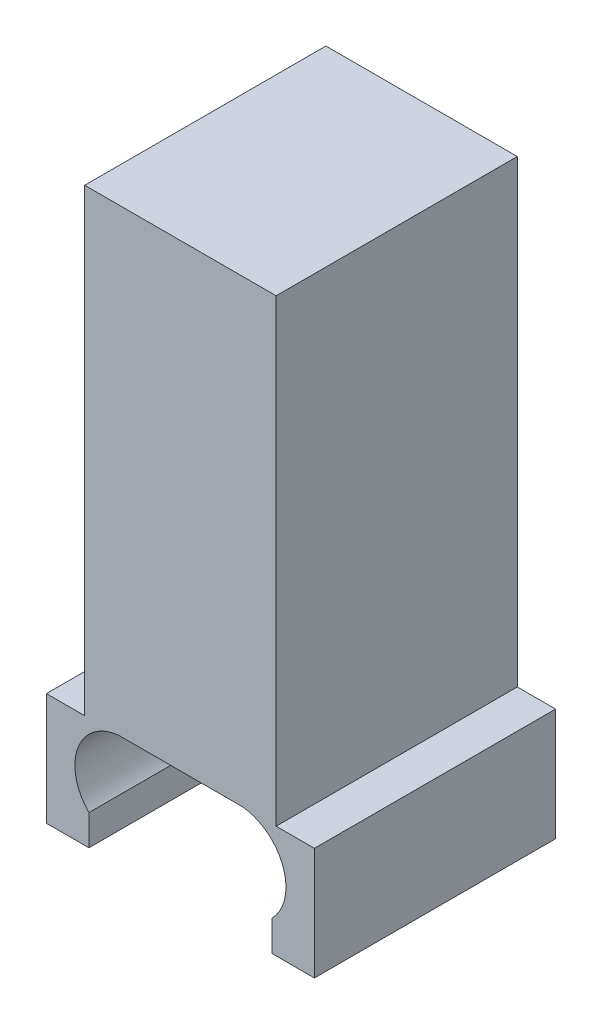
ISO-10303-21;
HEADER;
FILE_DESCRIPTION(('STEP AP214'),'2;1');
FILE_NAME('part.step','',(''),(''),'','','');
FILE_SCHEMA(('AUTOMOTIVE_DESIGN { 1 0 10303 214 1 1 1 1 }'));
ENDSEC;
DATA;
#1=APPLICATION_CONTEXT('core data for automotive mechanical design processes');
#2=APPLICATION_PROTOCOL_DEFINITION('international standard','automotive_design',2000,#1);
#3=PRODUCT_CONTEXT('',#1,'mechanical');
#4=PRODUCT('Part','Part','',(#3));
#5=PRODUCT_RELATED_PRODUCT_CATEGORY('part','',(#4));
#6=PRODUCT_DEFINITION_FORMATION('','',#4);
#7=PRODUCT_DEFINITION_CONTEXT('part definition',#1,'design');
#8=PRODUCT_DEFINITION('design','',#6,#7);
#9=PRODUCT_DEFINITION_SHAPE('','',#8);
#10=(LENGTH_UNIT() NAMED_UNIT(*) SI_UNIT(.MILLI.,.METRE.));
#11=(NAMED_UNIT(*) PLANE_ANGLE_UNIT() SI_UNIT($,.RADIAN.));
#12=(NAMED_UNIT(*) SI_UNIT($,.STERADIAN.) SOLID_ANGLE_UNIT());
#13=UNCERTAINTY_MEASURE_WITH_UNIT(LENGTH_MEASURE(1.E-05),#10,'distance_accuracy_value','');
#14=(GEOMETRIC_REPRESENTATION_CONTEXT(3) GLOBAL_UNCERTAINTY_ASSIGNED_CONTEXT((#13)) GLOBAL_UNIT_ASSIGNED_CONTEXT((#10,
#11,#12)) REPRESENTATION_CONTEXT('',''));
#15=CARTESIAN_POINT('',(0.,0.,0.));
#16=DIRECTION('',(0.,0.,1.));
#17=DIRECTION('',(1.,0.,0.));
#18=AXIS2_PLACEMENT_3D('',#15,#16,#17);
#19=CARTESIAN_POINT('',(12.5,-10.,0.));
#20=DIRECTION('',(0.,-1.,0.));
#21=DIRECTION('',(0.,0.,-1.));
#22=AXIS2_PLACEMENT_3D('',#19,#20,#21);
#23=PLANE('',#22);
#24=DIRECTION('',(0.,0.,-1.));
#25=VECTOR('',#24,1.);
#26=CARTESIAN_POINT('',(-8.11310684223875,-9.99999999999999,17.4156702281236));
#27=LINE('',#26,#25);
#28=CARTESIAN_POINT('',(-8.11310684223875,-9.99999999999998,0.));
#29=VERTEX_POINT('',#28);
#30=CARTESIAN_POINT('',(-8.11310684223875,-10.,-29.5));
#31=VERTEX_POINT('',#30);
#32=EDGE_CURVE('E195',#29,#31,#27,.T.);
#33=ORIENTED_EDGE('',*,*,#32,.T.);
#34=DIRECTION('',(1.,0.,0.));
#35=VECTOR('',#34,1.);
#36=CARTESIAN_POINT('',(12.5,-10.,-29.5));
#37=LINE('',#36,#35);
#38=CARTESIAN_POINT('',(8.11310684223875,-10.,-29.5));
#39=VERTEX_POINT('',#38);
#40=EDGE_CURVE('E59',#31,#39,#37,.T.);
#41=ORIENTED_EDGE('',*,*,#40,.T.);
#42=DIRECTION('',(0.,0.,-1.));
#43=VECTOR('',#42,1.);
#44=CARTESIAN_POINT('',(8.11310684223875,-9.99999999999999,17.4156702281236));
#45=LINE('',#44,#43);
#46=CARTESIAN_POINT('',(8.11310684223875,-10.,0.));
#47=VERTEX_POINT('',#46);
#48=EDGE_CURVE('E266',#47,#39,#45,.T.);
#49=ORIENTED_EDGE('',*,*,#48,.F.);
#50=DIRECTION('',(-1.,0.,0.));
#51=VECTOR('',#50,1.);
#52=CARTESIAN_POINT('',(12.5,-10.,0.));
#53=LINE('',#52,#51);
#54=EDGE_CURVE('E348',#47,#29,#53,.T.);
#55=ORIENTED_EDGE('',*,*,#54,.T.);
#56=EDGE_LOOP('',(#33,#41,#49,#55));
#57=FACE_BOUND('',#56,.T.);
#58=ADVANCED_FACE('F41',(#57),#23,.T.);
#59=CARTESIAN_POINT('',(7.5,-16.25,17.4156702281236));
#60=DIRECTION('',(0.,0.,-1.));
#61=DIRECTION('',(0.,1.,0.));
#62=AXIS2_PLACEMENT_3D('',#59,#60,#61);
#63=CYLINDRICAL_SURFACE('',#62,6.28);
#64=CARTESIAN_POINT('',(7.5,-16.25,-29.5));
#65=DIRECTION('',(0.,0.,-1.));
#66=DIRECTION('',(0.,1.,0.));
#67=AXIS2_PLACEMENT_3D('',#64,#65,#66);
#68=CIRCLE('',#67,6.28);
#69=CARTESIAN_POINT('',(11.9494173824159,-20.6818263681077,-29.5));
#70=VERTEX_POINT('',#69);
#71=EDGE_CURVE('E66',#39,#70,#68,.T.);
#72=ORIENTED_EDGE('',*,*,#71,.T.);
#73=DIRECTION('',(0.,0.,-1.));
#74=VECTOR('',#73,1.);
#75=CARTESIAN_POINT('',(11.9494173824159,-20.6818263681077,17.4156702281236));
#76=LINE('',#75,#74);
#77=CARTESIAN_POINT('',(11.9494173824159,-20.6818263681077,0.));
#78=VERTEX_POINT('',#77);
#79=EDGE_CURVE('E263',#78,#70,#76,.T.);
#80=ORIENTED_EDGE('',*,*,#79,.F.);
#81=CARTESIAN_POINT('',(7.5,-16.25,0.));
#82=DIRECTION('',(0.,0.,1.));
#83=DIRECTION('',(1.,0.,0.));
#84=AXIS2_PLACEMENT_3D('',#81,#82,#83);
#85=CIRCLE('',#84,6.28);
#86=EDGE_CURVE('E256',#47,#78,#85,.F.);
#87=ORIENTED_EDGE('',*,*,#86,.F.);
#88=ORIENTED_EDGE('',*,*,#48,.T.);
#89=EDGE_LOOP('',(#72,#80,#87,#88));
#90=FACE_BOUND('',#89,.T.);
#91=ADVANCED_FACE('F417',(#90),#63,.F.);
#92=CARTESIAN_POINT('',(11.9494173824159,0.,17.4156702281236));
#93=DIRECTION('',(1.,0.,0.));
#94=DIRECTION('',(0.,0.,-1.));
#95=AXIS2_PLACEMENT_3D('',#92,#93,#94);
#96=PLANE('',#95);
#97=DIRECTION('',(0.,-1.,0.));
#98=VECTOR('',#97,1.);
#99=CARTESIAN_POINT('',(11.9494173824159,0.,-29.5));
#100=LINE('',#99,#98);
#101=CARTESIAN_POINT('',(11.9494173824159,-24.6694173824159,-29.5));
#102=VERTEX_POINT('',#101);
#103=EDGE_CURVE('E400',#70,#102,#100,.T.);
#104=ORIENTED_EDGE('',*,*,#103,.T.);
#105=DIRECTION('',(0.,0.,-1.));
#106=VECTOR('',#105,1.);
#107=CARTESIAN_POINT('',(11.9494173824159,-24.6694173824159,17.4156702281236));
#108=LINE('',#107,#106);
#109=CARTESIAN_POINT('',(11.9494173824159,-24.6694173824159,0.));
#110=VERTEX_POINT('',#109);
#111=EDGE_CURVE('E232',#110,#102,#108,.T.);
#112=ORIENTED_EDGE('',*,*,#111,.F.);
#113=DIRECTION('',(0.,-1.,0.));
#114=VECTOR('',#113,1.);
#115=CARTESIAN_POINT('',(11.9494173824159,0.,0.));
#116=LINE('',#115,#114);
#117=EDGE_CURVE('E252',#78,#110,#116,.T.);
#118=ORIENTED_EDGE('',*,*,#117,.F.);
#119=ORIENTED_EDGE('',*,*,#79,.T.);
#120=EDGE_LOOP('',(#104,#112,#118,#119));
#121=FACE_BOUND('',#120,.T.);
#122=ADVANCED_FACE('F420',(#121),#96,.F.);
#123=CARTESIAN_POINT('',(-7.5,-16.25,17.4156702281236));
#124=DIRECTION('',(0.,0.,-1.));
#125=DIRECTION('',(0.,1.,0.));
#126=AXIS2_PLACEMENT_3D('',#123,#124,#125);
#127=CYLINDRICAL_SURFACE('',#126,6.28);
#128=DIRECTION('',(0.,0.,-1.));
#129=VECTOR('',#128,1.);
#130=CARTESIAN_POINT('',(-11.9494173824159,-20.6818263681077,17.4156702281236));
#131=LINE('',#130,#129);
#132=CARTESIAN_POINT('',(-11.9494173824159,-20.6818263681077,0.));
#133=VERTEX_POINT('',#132);
#134=CARTESIAN_POINT('',(-11.9494173824159,-20.6818263681077,-29.5));
#135=VERTEX_POINT('',#134);
#136=EDGE_CURVE('E184',#133,#135,#131,.T.);
#137=ORIENTED_EDGE('',*,*,#136,.T.);
#138=CARTESIAN_POINT('',(-7.5,-16.25,-29.5));
#139=DIRECTION('',(0.,0.,-1.));
#140=DIRECTION('',(0.,1.,0.));
#141=AXIS2_PLACEMENT_3D('',#138,#139,#140);
#142=CIRCLE('',#141,6.28);
#143=EDGE_CURVE('E409',#31,#135,#142,.F.);
#144=ORIENTED_EDGE('',*,*,#143,.F.);
#145=ORIENTED_EDGE('',*,*,#32,.F.);
#146=CARTESIAN_POINT('',(-7.5,-16.25,0.));
#147=DIRECTION('',(0.,0.,1.));
#148=DIRECTION('',(1.,0.,0.));
#149=AXIS2_PLACEMENT_3D('',#146,#147,#148);
#150=CIRCLE('',#149,6.28);
#151=EDGE_CURVE('E176',#29,#133,#150,.T.);
#152=ORIENTED_EDGE('',*,*,#151,.T.);
#153=EDGE_LOOP('',(#137,#144,#145,#152));
#154=FACE_BOUND('',#153,.T.);
#155=ADVANCED_FACE('F194',(#154),#127,.F.);
#156=CARTESIAN_POINT('',(-11.9494173824159,0.,17.4156702281236));
#157=DIRECTION('',(1.,0.,0.));
#158=DIRECTION('',(0.,0.,-1.));
#159=AXIS2_PLACEMENT_3D('',#156,#157,#158);
#160=PLANE('',#159);
#161=DIRECTION('',(0.,0.,-1.));
#162=VECTOR('',#161,1.);
#163=CARTESIAN_POINT('',(-11.9494173824159,-24.6694173824159,17.4156702281236));
#164=LINE('',#163,#162);
#165=CARTESIAN_POINT('',(-11.9494173824159,-24.6694173824159,0.));
#166=VERTEX_POINT('',#165);
#167=CARTESIAN_POINT('',(-11.9494173824159,-24.6694173824159,-29.5));
#168=VERTEX_POINT('',#167);
#169=EDGE_CURVE('E183',#166,#168,#164,.T.);
#170=ORIENTED_EDGE('',*,*,#169,.T.);
#171=DIRECTION('',(0.,-1.,0.));
#172=VECTOR('',#171,1.);
#173=CARTESIAN_POINT('',(-11.9494173824159,0.,-29.5));
#174=LINE('',#173,#172);
#175=EDGE_CURVE('E189',#135,#168,#174,.T.);
#176=ORIENTED_EDGE('',*,*,#175,.F.);
#177=ORIENTED_EDGE('',*,*,#136,.F.);
#178=DIRECTION('',(0.,-1.,0.));
#179=VECTOR('',#178,1.);
#180=CARTESIAN_POINT('',(-11.9494173824159,0.,0.));
#181=LINE('',#180,#179);
#182=EDGE_CURVE('E170',#133,#166,#181,.T.);
#183=ORIENTED_EDGE('',*,*,#182,.T.);
#184=EDGE_LOOP('',(#170,#176,#177,#183));
#185=FACE_BOUND('',#184,.T.);
#186=ADVANCED_FACE('F187',(#185),#160,.T.);
#187=CARTESIAN_POINT('',(12.5,0.,-31.5));
#188=DIRECTION('',(0.,0.,-1.));
#189=DIRECTION('',(0.,1.,0.));
#190=AXIS2_PLACEMENT_3D('',#187,#188,#189);
#191=PLANE('',#190);
#192=CARTESIAN_POINT('',(-7.5,-16.25,-31.5));
#193=DIRECTION('',(0.,0.,1.));
#194=DIRECTION('',(1.,0.,0.));
#195=AXIS2_PLACEMENT_3D('',#192,#193,#194);
#196=CIRCLE('',#195,1.6);
#197=CARTESIAN_POINT('',(-5.9,-16.25,-31.5));
#198=VERTEX_POINT('',#197);
#199=EDGE_CURVE('E383',#198,#198,#196,.T.);
#200=ORIENTED_EDGE('',*,*,#199,.T.);
#201=EDGE_LOOP('',(#200));
#202=FACE_BOUND('',#201,.T.);
#203=CARTESIAN_POINT('',(7.5,-16.25,-31.5));
#204=DIRECTION('',(0.,0.,1.));
#205=DIRECTION('',(1.,0.,0.));
#206=AXIS2_PLACEMENT_3D('',#203,#204,#205);
#207=CIRCLE('',#206,1.6);
#208=CARTESIAN_POINT('',(9.1,-16.25,-31.5));
#209=VERTEX_POINT('',#208);
#210=EDGE_CURVE('E390',#209,#209,#207,.T.);
#211=ORIENTED_EDGE('',*,*,#210,.T.);
#212=EDGE_LOOP('',(#211));
#213=FACE_BOUND('',#212,.T.);
#214=DIRECTION('',(-1.,0.,0.));
#215=VECTOR('',#214,1.);
#216=CARTESIAN_POINT('',(0.,-10.,-31.5));
#217=LINE('',#216,#215);
#218=CARTESIAN_POINT('',(-12.5,-10.,-31.5));
#219=VERTEX_POINT('',#218);
#220=CARTESIAN_POINT('',(-17.5,-9.99999999999999,-31.5));
#221=VERTEX_POINT('',#220);
#222=EDGE_CURVE('E206',#219,#221,#217,.T.);
#223=ORIENTED_EDGE('',*,*,#222,.F.);
#224=DIRECTION('',(0.,-1.,0.));
#225=VECTOR('',#224,1.);
#226=CARTESIAN_POINT('',(-12.5,0.,-31.5));
#227=LINE('',#226,#225);
#228=CARTESIAN_POINT('',(-12.5,50.,-31.5));
#229=VERTEX_POINT('',#228);
#230=EDGE_CURVE('E325',#229,#219,#227,.T.);
#231=ORIENTED_EDGE('',*,*,#230,.F.);
#232=DIRECTION('',(-1.,0.,0.));
#233=VECTOR('',#232,1.);
#234=CARTESIAN_POINT('',(12.5,50.,-31.5));
#235=LINE('',#234,#233);
#236=CARTESIAN_POINT('',(12.5,50.,-31.5));
#237=VERTEX_POINT('',#236);
#238=EDGE_CURVE('E366',#237,#229,#235,.T.);
#239=ORIENTED_EDGE('',*,*,#238,.F.);
#240=DIRECTION('',(0.,-1.,0.));
#241=VECTOR('',#240,1.);
#242=CARTESIAN_POINT('',(12.5,0.,-31.5));
#243=LINE('',#242,#241);
#244=CARTESIAN_POINT('',(12.5,-10.,-31.5));
#245=VERTEX_POINT('',#244);
#246=EDGE_CURVE('E334',#237,#245,#243,.T.);
#247=ORIENTED_EDGE('',*,*,#246,.T.);
#248=DIRECTION('',(-1.,0.,0.));
#249=VECTOR('',#248,1.);
#250=CARTESIAN_POINT('',(0.,-10.,-31.5));
#251=LINE('',#250,#249);
#252=CARTESIAN_POINT('',(17.5,-9.99999999999999,-31.5));
#253=VERTEX_POINT('',#252);
#254=EDGE_CURVE('E238',#253,#245,#251,.T.);
#255=ORIENTED_EDGE('',*,*,#254,.F.);
#256=DIRECTION('',(0.,1.,0.));
#257=VECTOR('',#256,1.);
#258=CARTESIAN_POINT('',(17.5,0.,-31.5));
#259=LINE('',#258,#257);
#260=CARTESIAN_POINT('',(17.5,-24.6694173824159,-31.5));
#261=VERTEX_POINT('',#260);
#262=EDGE_CURVE('E233',#261,#253,#259,.T.);
#263=ORIENTED_EDGE('',*,*,#262,.F.);
#264=DIRECTION('',(1.,0.,0.));
#265=VECTOR('',#264,1.);
#266=CARTESIAN_POINT('',(0.,-24.6694173824159,-31.5));
#267=LINE('',#266,#265);
#268=CARTESIAN_POINT('',(-17.5,-24.6694173824159,-31.5));
#269=VERTEX_POINT('',#268);
#270=EDGE_CURVE('E227',#269,#261,#267,.T.);
#271=ORIENTED_EDGE('',*,*,#270,.F.);
#272=DIRECTION('',(0.,1.,0.));
#273=VECTOR('',#272,1.);
#274=CARTESIAN_POINT('',(-17.5,0.,-31.5));
#275=LINE('',#274,#273);
#276=EDGE_CURVE('E198',#269,#221,#275,.T.);
#277=ORIENTED_EDGE('',*,*,#276,.T.);
#278=EDGE_LOOP('',(#223,#231,#239,#247,#255,#263,#271,#277));
#279=FACE_BOUND('',#278,.T.);
#280=CARTESIAN_POINT('',(5.,-4.00000000000001,-31.5));
#281=DIRECTION('',(0.,0.,-1.));
#282=DIRECTION('',(0.,1.,0.));
#283=AXIS2_PLACEMENT_3D('',#280,#281,#282);
#284=CIRCLE('',#283,3.25);
#285=CARTESIAN_POINT('',(5.,-0.750000000000013,-31.5));
#286=VERTEX_POINT('',#285);
#287=EDGE_CURVE('E247',#286,#286,#284,.T.);
#288=ORIENTED_EDGE('',*,*,#287,.F.);
#289=EDGE_LOOP('',(#288));
#290=FACE_BOUND('',#289,.T.);
#291=CARTESIAN_POINT('',(-5.,-4.00000000000001,-31.5));
#292=DIRECTION('',(0.,0.,-1.));
#293=DIRECTION('',(0.,1.,0.));
#294=AXIS2_PLACEMENT_3D('',#291,#292,#293);
#295=CIRCLE('',#294,3.25);
#296=CARTESIAN_POINT('',(-5.,-0.750000000000013,-31.5));
#297=VERTEX_POINT('',#296);
#298=EDGE_CURVE('E289',#297,#297,#295,.T.);
#299=ORIENTED_EDGE('',*,*,#298,.F.);
#300=EDGE_LOOP('',(#299));
#301=FACE_BOUND('',#300,.T.);
#302=CARTESIAN_POINT('',(-5.,44.,-31.5));
#303=DIRECTION('',(0.,0.,-1.));
#304=DIRECTION('',(0.,1.,0.));
#305=AXIS2_PLACEMENT_3D('',#302,#303,#304);
#306=CIRCLE('',#305,3.25);
#307=CARTESIAN_POINT('',(-5.,47.25,-31.5));
#308=VERTEX_POINT('',#307);
#309=EDGE_CURVE('E281',#308,#308,#306,.T.);
#310=ORIENTED_EDGE('',*,*,#309,.F.);
#311=EDGE_LOOP('',(#310));
#312=FACE_BOUND('',#311,.T.);
#313=CARTESIAN_POINT('',(5.,44.,-31.5));
#314=DIRECTION('',(0.,0.,-1.));
#315=DIRECTION('',(0.,1.,0.));
#316=AXIS2_PLACEMENT_3D('',#313,#314,#315);
#317=CIRCLE('',#316,3.25);
#318=CARTESIAN_POINT('',(5.,47.25,-31.5));
#319=VERTEX_POINT('',#318);
#320=EDGE_CURVE('E280',#319,#319,#317,.T.);
#321=ORIENTED_EDGE('',*,*,#320,.F.);
#322=EDGE_LOOP('',(#321));
#323=FACE_BOUND('',#322,.T.);
#324=DIRECTION('',(1.,0.,0.));
#325=VECTOR('',#324,1.);
#326=CARTESIAN_POINT('',(12.5,40.015,-31.5));
#327=LINE('',#326,#325);
#328=CARTESIAN_POINT('',(-10.015,40.015,-31.5));
#329=VERTEX_POINT('',#328);
#330=CARTESIAN_POINT('',(10.015,40.015,-31.5));
#331=VERTEX_POINT('',#330);
#332=EDGE_CURVE('E11',#329,#331,#327,.T.);
#333=ORIENTED_EDGE('',*,*,#332,.F.);
#334=DIRECTION('',(0.,1.,0.));
#335=VECTOR('',#334,1.);
#336=CARTESIAN_POINT('',(-10.015,0.,-31.5));
#337=LINE('',#336,#335);
#338=CARTESIAN_POINT('',(-10.015,-0.015000000000007,-31.5));
#339=VERTEX_POINT('',#338);
#340=EDGE_CURVE('E51',#339,#329,#337,.T.);
#341=ORIENTED_EDGE('',*,*,#340,.F.);
#342=DIRECTION('',(1.,0.,0.));
#343=VECTOR('',#342,1.);
#344=CARTESIAN_POINT('',(12.5,-0.0150000000000098,-31.5));
#345=LINE('',#344,#343);
#346=CARTESIAN_POINT('',(10.015,-0.0150000000000095,-31.5));
#347=VERTEX_POINT('',#346);
#348=EDGE_CURVE('E374',#339,#347,#345,.T.);
#349=ORIENTED_EDGE('',*,*,#348,.T.);
#350=DIRECTION('',(0.,1.,0.));
#351=VECTOR('',#350,1.);
#352=CARTESIAN_POINT('',(10.015,0.,-31.5));
#353=LINE('',#352,#351);
#354=EDGE_CURVE('E370',#347,#331,#353,.T.);
#355=ORIENTED_EDGE('',*,*,#354,.T.);
#356=EDGE_LOOP('',(#333,#341,#349,#355));
#357=FACE_BOUND('',#356,.T.);
#358=ADVANCED_FACE('F43',(#202,#213,#279,#290,#301,#312,#323,#357),#191,.T.);
#359=CARTESIAN_POINT('',(12.5,50.,0.));
#360=DIRECTION('',(0.,1.,0.));
#361=DIRECTION('',(0.,0.,1.));
#362=AXIS2_PLACEMENT_3D('',#359,#360,#361);
#363=PLANE('',#362);
#364=ORIENTED_EDGE('',*,*,#238,.T.);
#365=DIRECTION('',(0.,0.,-1.));
#366=VECTOR('',#365,1.);
#367=CARTESIAN_POINT('',(-12.5,50.,0.));
#368=LINE('',#367,#366);
#369=CARTESIAN_POINT('',(-12.5,50.,0.));
#370=VERTEX_POINT('',#369);
#371=EDGE_CURVE('E352',#370,#229,#368,.T.);
#372=ORIENTED_EDGE('',*,*,#371,.F.);
#373=DIRECTION('',(-1.,0.,0.));
#374=VECTOR('',#373,1.);
#375=CARTESIAN_POINT('',(12.5,50.,0.));
#376=LINE('',#375,#374);
#377=CARTESIAN_POINT('',(12.5,50.,0.));
#378=VERTEX_POINT('',#377);
#379=EDGE_CURVE('E363',#378,#370,#376,.T.);
#380=ORIENTED_EDGE('',*,*,#379,.F.);
#381=DIRECTION('',(0.,0.,-1.));
#382=VECTOR('',#381,1.);
#383=CARTESIAN_POINT('',(12.5,50.,0.));
#384=LINE('',#383,#382);
#385=EDGE_CURVE('E337',#378,#237,#384,.T.);
#386=ORIENTED_EDGE('',*,*,#385,.T.);
#387=EDGE_LOOP('',(#364,#372,#380,#386));
#388=FACE_BOUND('',#387,.T.);
#389=ADVANCED_FACE('F446',(#388),#363,.T.);
#390=CARTESIAN_POINT('',(12.5,0.,0.));
#391=DIRECTION('',(0.,0.,1.));
#392=DIRECTION('',(1.,0.,0.));
#393=AXIS2_PLACEMENT_3D('',#390,#391,#392);
#394=PLANE('',#393);
#395=DIRECTION('',(0.,1.,0.));
#396=VECTOR('',#395,1.);
#397=CARTESIAN_POINT('',(-12.5,0.,0.));
#398=LINE('',#397,#396);
#399=CARTESIAN_POINT('',(-12.5,-10.,0.));
#400=VERTEX_POINT('',#399);
#401=EDGE_CURVE('E355',#400,#370,#398,.T.);
#402=ORIENTED_EDGE('',*,*,#401,.F.);
#403=DIRECTION('',(-1.,0.,0.));
#404=VECTOR('',#403,1.);
#405=CARTESIAN_POINT('',(0.,-9.99999999999999,0.));
#406=LINE('',#405,#404);
#407=CARTESIAN_POINT('',(-17.5,-9.99999999999998,0.));
#408=VERTEX_POINT('',#407);
#409=EDGE_CURVE('E202',#400,#408,#406,.T.);
#410=ORIENTED_EDGE('',*,*,#409,.T.);
#411=DIRECTION('',(0.,1.,0.));
#412=VECTOR('',#411,1.);
#413=CARTESIAN_POINT('',(-17.5,0.,0.));
#414=LINE('',#413,#412);
#415=CARTESIAN_POINT('',(-17.5,-24.6694173824159,0.));
#416=VERTEX_POINT('',#415);
#417=EDGE_CURVE('E209',#416,#408,#414,.T.);
#418=ORIENTED_EDGE('',*,*,#417,.F.);
#419=DIRECTION('',(-1.,0.,0.));
#420=VECTOR('',#419,1.);
#421=CARTESIAN_POINT('',(0.,-24.6694173824159,0.));
#422=LINE('',#421,#420);
#423=EDGE_CURVE('E179',#166,#416,#422,.T.);
#424=ORIENTED_EDGE('',*,*,#423,.F.);
#425=ORIENTED_EDGE('',*,*,#182,.F.);
#426=ORIENTED_EDGE('',*,*,#151,.F.);
#427=ORIENTED_EDGE('',*,*,#54,.F.);
#428=ORIENTED_EDGE('',*,*,#86,.T.);
#429=ORIENTED_EDGE('',*,*,#117,.T.);
#430=DIRECTION('',(1.,0.,0.));
#431=VECTOR('',#430,1.);
#432=CARTESIAN_POINT('',(0.,-24.6694173824159,0.));
#433=LINE('',#432,#431);
#434=CARTESIAN_POINT('',(17.5,-24.6694173824159,0.));
#435=VERTEX_POINT('',#434);
#436=EDGE_CURVE('E248',#110,#435,#433,.T.);
#437=ORIENTED_EDGE('',*,*,#436,.T.);
#438=DIRECTION('',(0.,1.,0.));
#439=VECTOR('',#438,1.);
#440=CARTESIAN_POINT('',(17.5,0.,0.));
#441=LINE('',#440,#439);
#442=CARTESIAN_POINT('',(17.5,-9.99999999999998,0.));
#443=VERTEX_POINT('',#442);
#444=EDGE_CURVE('E243',#435,#443,#441,.T.);
#445=ORIENTED_EDGE('',*,*,#444,.T.);
#446=DIRECTION('',(-1.,0.,0.));
#447=VECTOR('',#446,1.);
#448=CARTESIAN_POINT('',(0.,-9.99999999999999,0.));
#449=LINE('',#448,#447);
#450=CARTESIAN_POINT('',(12.5,-10.,0.));
#451=VERTEX_POINT('',#450);
#452=EDGE_CURVE('E242',#443,#451,#449,.T.);
#453=ORIENTED_EDGE('',*,*,#452,.T.);
#454=DIRECTION('',(0.,1.,0.));
#455=VECTOR('',#454,1.);
#456=CARTESIAN_POINT('',(12.5,0.,0.));
#457=LINE('',#456,#455);
#458=EDGE_CURVE('E341',#451,#378,#457,.T.);
#459=ORIENTED_EDGE('',*,*,#458,.T.);
#460=ORIENTED_EDGE('',*,*,#379,.T.);
#461=EDGE_LOOP('',(#402,#410,#418,#424,#425,#426,#427,#428,#429,#437,#445,#453,#459,#460));
#462=FACE_BOUND('',#461,.T.);
#463=ADVANCED_FACE('F173',(#462),#394,.T.);
#464=CARTESIAN_POINT('',(12.5,0.,0.));
#465=DIRECTION('',(1.,0.,0.));
#466=DIRECTION('',(0.,0.,-1.));
#467=AXIS2_PLACEMENT_3D('',#464,#465,#466);
#468=PLANE('',#467);
#469=ORIENTED_EDGE('',*,*,#246,.F.);
#470=ORIENTED_EDGE('',*,*,#385,.F.);
#471=ORIENTED_EDGE('',*,*,#458,.F.);
#472=DIRECTION('',(0.,0.,1.));
#473=VECTOR('',#472,1.);
#474=CARTESIAN_POINT('',(12.5,-10.,0.));
#475=LINE('',#474,#473);
#476=EDGE_CURVE('E345',#245,#451,#475,.T.);
#477=ORIENTED_EDGE('',*,*,#476,.F.);
#478=EDGE_LOOP('',(#469,#470,#471,#477));
#479=FACE_BOUND('',#478,.T.);
#480=ADVANCED_FACE('F443',(#479),#468,.T.);
#481=CARTESIAN_POINT('',(-12.5,0.,0.));
#482=DIRECTION('',(1.,0.,0.));
#483=DIRECTION('',(0.,0.,-1.));
#484=AXIS2_PLACEMENT_3D('',#481,#482,#483);
#485=PLANE('',#484);
#486=DIRECTION('',(0.,0.,1.));
#487=VECTOR('',#486,1.);
#488=CARTESIAN_POINT('',(-12.5,-10.,0.));
#489=LINE('',#488,#487);
#490=EDGE_CURVE('E338',#219,#400,#489,.T.);
#491=ORIENTED_EDGE('',*,*,#490,.T.);
#492=ORIENTED_EDGE('',*,*,#401,.T.);
#493=ORIENTED_EDGE('',*,*,#371,.T.);
#494=ORIENTED_EDGE('',*,*,#230,.T.);
#495=EDGE_LOOP('',(#491,#492,#493,#494));
#496=FACE_BOUND('',#495,.T.);
#497=ADVANCED_FACE('F449',(#496),#485,.F.);
#498=CARTESIAN_POINT('',(0.,40.015,-17.735));
#499=DIRECTION('',(0.,1.,0.));
#500=DIRECTION('',(0.,0.,1.));
#501=AXIS2_PLACEMENT_3D('',#498,#499,#500);
#502=PLANE('',#501);
#503=ORIENTED_EDGE('',*,*,#332,.T.);
#504=DIRECTION('',(0.,0.,-1.));
#505=VECTOR('',#504,1.);
#506=CARTESIAN_POINT('',(10.015,40.015,-17.735));
#507=LINE('',#506,#505);
#508=CARTESIAN_POINT('',(10.015,40.015,-17.735));
#509=VERTEX_POINT('',#508);
#510=EDGE_CURVE('E321',#509,#331,#507,.T.);
#511=ORIENTED_EDGE('',*,*,#510,.F.);
#512=DIRECTION('',(1.,0.,0.));
#513=VECTOR('',#512,1.);
#514=CARTESIAN_POINT('',(0.,40.015,-17.735));
#515=LINE('',#514,#513);
#516=CARTESIAN_POINT('',(-10.015,40.015,-17.735));
#517=VERTEX_POINT('',#516);
#518=EDGE_CURVE('E304',#517,#509,#515,.T.);
#519=ORIENTED_EDGE('',*,*,#518,.F.);
#520=DIRECTION('',(0.,0.,-1.));
#521=VECTOR('',#520,1.);
#522=CARTESIAN_POINT('',(-10.015,40.015,-17.735));
#523=LINE('',#522,#521);
#524=EDGE_CURVE('E322',#517,#329,#523,.T.);
#525=ORIENTED_EDGE('',*,*,#524,.T.);
#526=EDGE_LOOP('',(#503,#511,#519,#525));
#527=FACE_BOUND('',#526,.T.);
#528=ADVANCED_FACE('F633',(#527),#502,.F.);
#529=CARTESIAN_POINT('',(-10.015,0.,-17.735));
#530=DIRECTION('',(-1.,0.,0.));
#531=DIRECTION('',(0.,0.,1.));
#532=AXIS2_PLACEMENT_3D('',#529,#530,#531);
#533=PLANE('',#532);
#534=ORIENTED_EDGE('',*,*,#340,.T.);
#535=ORIENTED_EDGE('',*,*,#524,.F.);
#536=DIRECTION('',(0.,1.,0.));
#537=VECTOR('',#536,1.);
#538=CARTESIAN_POINT('',(-10.015,0.,-17.735));
#539=LINE('',#538,#537);
#540=CARTESIAN_POINT('',(-10.015,-0.0150000000000118,-17.735));
#541=VERTEX_POINT('',#540);
#542=EDGE_CURVE('E317',#541,#517,#539,.T.);
#543=ORIENTED_EDGE('',*,*,#542,.F.);
#544=DIRECTION('',(0.,0.,-1.));
#545=VECTOR('',#544,1.);
#546=CARTESIAN_POINT('',(-10.015,-0.0150000000000118,-17.735));
#547=LINE('',#546,#545);
#548=EDGE_CURVE('E326',#541,#339,#547,.T.);
#549=ORIENTED_EDGE('',*,*,#548,.T.);
#550=EDGE_LOOP('',(#534,#535,#543,#549));
#551=FACE_BOUND('',#550,.T.);
#552=ADVANCED_FACE('F623',(#551),#533,.F.);
#553=CARTESIAN_POINT('',(0.,-0.015000000000013,-17.735));
#554=DIRECTION('',(0.,1.,0.));
#555=DIRECTION('',(0.,0.,1.));
#556=AXIS2_PLACEMENT_3D('',#553,#554,#555);
#557=PLANE('',#556);
#558=ORIENTED_EDGE('',*,*,#348,.F.);
#559=ORIENTED_EDGE('',*,*,#548,.F.);
#560=DIRECTION('',(1.,0.,0.));
#561=VECTOR('',#560,1.);
#562=CARTESIAN_POINT('',(0.,-0.015000000000013,-17.735));
#563=LINE('',#562,#561);
#564=CARTESIAN_POINT('',(10.015,-0.0150000000000143,-17.735));
#565=VERTEX_POINT('',#564);
#566=EDGE_CURVE('E314',#541,#565,#563,.T.);
#567=ORIENTED_EDGE('',*,*,#566,.T.);
#568=DIRECTION('',(0.,0.,-1.));
#569=VECTOR('',#568,1.);
#570=CARTESIAN_POINT('',(10.015,-0.0150000000000143,-17.735));
#571=LINE('',#570,#569);
#572=EDGE_CURVE('E329',#565,#347,#571,.T.);
#573=ORIENTED_EDGE('',*,*,#572,.T.);
#574=EDGE_LOOP('',(#558,#559,#567,#573));
#575=FACE_BOUND('',#574,.T.);
#576=ADVANCED_FACE('F612',(#575),#557,.T.);
#577=CARTESIAN_POINT('',(10.015,0.,-17.735));
#578=DIRECTION('',(-1.,0.,0.));
#579=DIRECTION('',(0.,0.,1.));
#580=AXIS2_PLACEMENT_3D('',#577,#578,#579);
#581=PLANE('',#580);
#582=ORIENTED_EDGE('',*,*,#354,.F.);
#583=ORIENTED_EDGE('',*,*,#572,.F.);
#584=DIRECTION('',(0.,1.,0.));
#585=VECTOR('',#584,1.);
#586=CARTESIAN_POINT('',(10.015,0.,-17.735));
#587=LINE('',#586,#585);
#588=EDGE_CURVE('E311',#565,#509,#587,.T.);
#589=ORIENTED_EDGE('',*,*,#588,.T.);
#590=ORIENTED_EDGE('',*,*,#510,.T.);
#591=EDGE_LOOP('',(#582,#583,#589,#590));
#592=FACE_BOUND('',#591,.T.);
#593=ADVANCED_FACE('F607',(#592),#581,.T.);
#594=CARTESIAN_POINT('',(0.,0.,-17.735));
#595=DIRECTION('',(0.,0.,-1.));
#596=DIRECTION('',(0.,1.,0.));
#597=AXIS2_PLACEMENT_3D('',#594,#595,#596);
#598=PLANE('',#597);
#599=ORIENTED_EDGE('',*,*,#518,.T.);
#600=ORIENTED_EDGE('',*,*,#588,.F.);
#601=ORIENTED_EDGE('',*,*,#566,.F.);
#602=ORIENTED_EDGE('',*,*,#542,.T.);
#603=EDGE_LOOP('',(#599,#600,#601,#602));
#604=FACE_BOUND('',#603,.T.);
#605=ADVANCED_FACE('F599',(#604),#598,.T.);
#606=CARTESIAN_POINT('',(5.,44.,-19.5));
#607=DIRECTION('',(0.,0.,-1.));
#608=DIRECTION('',(0.,1.,0.));
#609=AXIS2_PLACEMENT_3D('',#606,#607,#608);
#610=CYLINDRICAL_SURFACE('',#609,3.25);
#611=ORIENTED_EDGE('',*,*,#320,.T.);
#612=EDGE_LOOP('',(#611));
#613=FACE_BOUND('',#612,.T.);
#614=CARTESIAN_POINT('',(5.,44.,-19.5));
#615=DIRECTION('',(0.,0.,-1.));
#616=DIRECTION('',(0.,1.,0.));
#617=AXIS2_PLACEMENT_3D('',#614,#615,#616);
#618=CIRCLE('',#617,3.25);
#619=CARTESIAN_POINT('',(5.,47.25,-19.5));
#620=VERTEX_POINT('',#619);
#621=EDGE_CURVE('E300',#620,#620,#618,.T.);
#622=ORIENTED_EDGE('',*,*,#621,.F.);
#623=EDGE_LOOP('',(#622));
#624=FACE_BOUND('',#623,.T.);
#625=ADVANCED_FACE('F594',(#613,#624),#610,.F.);
#626=CARTESIAN_POINT('',(5.,44.,-19.5));
#627=DIRECTION('',(0.,0.,-1.));
#628=DIRECTION('',(0.,1.,0.));
#629=AXIS2_PLACEMENT_3D('',#626,#627,#628);
#630=PLANE('',#629);
#631=ORIENTED_EDGE('',*,*,#621,.T.);
#632=EDGE_LOOP('',(#631));
#633=FACE_BOUND('',#632,.T.);
#634=ADVANCED_FACE('F586',(#633),#630,.T.);
#635=CARTESIAN_POINT('',(-5.,44.,-19.5));
#636=DIRECTION('',(0.,0.,-1.));
#637=DIRECTION('',(0.,1.,0.));
#638=AXIS2_PLACEMENT_3D('',#635,#636,#637);
#639=CYLINDRICAL_SURFACE('',#638,3.25);
#640=ORIENTED_EDGE('',*,*,#309,.T.);
#641=EDGE_LOOP('',(#640));
#642=FACE_BOUND('',#641,.T.);
#643=CARTESIAN_POINT('',(-5.,44.,-19.5));
#644=DIRECTION('',(0.,0.,-1.));
#645=DIRECTION('',(0.,1.,0.));
#646=AXIS2_PLACEMENT_3D('',#643,#644,#645);
#647=CIRCLE('',#646,3.25);
#648=CARTESIAN_POINT('',(-5.,47.25,-19.5));
#649=VERTEX_POINT('',#648);
#650=EDGE_CURVE('E276',#649,#649,#647,.T.);
#651=ORIENTED_EDGE('',*,*,#650,.F.);
#652=EDGE_LOOP('',(#651));
#653=FACE_BOUND('',#652,.T.);
#654=ADVANCED_FACE('F581',(#642,#653),#639,.F.);
#655=CARTESIAN_POINT('',(-5.,44.,-19.5));
#656=DIRECTION('',(0.,0.,-1.));
#657=DIRECTION('',(0.,1.,0.));
#658=AXIS2_PLACEMENT_3D('',#655,#656,#657);
#659=PLANE('',#658);
#660=ORIENTED_EDGE('',*,*,#650,.T.);
#661=EDGE_LOOP('',(#660));
#662=FACE_BOUND('',#661,.T.);
#663=ADVANCED_FACE('F573',(#662),#659,.T.);
#664=CARTESIAN_POINT('',(-5.,-4.00000000000001,-19.5));
#665=DIRECTION('',(0.,0.,-1.));
#666=DIRECTION('',(0.,1.,0.));
#667=AXIS2_PLACEMENT_3D('',#664,#665,#666);
#668=CYLINDRICAL_SURFACE('',#667,3.25);
#669=ORIENTED_EDGE('',*,*,#298,.T.);
#670=EDGE_LOOP('',(#669));
#671=FACE_BOUND('',#670,.T.);
#672=CARTESIAN_POINT('',(-5.,-4.00000000000001,-19.5));
#673=DIRECTION('',(0.,0.,-1.));
#674=DIRECTION('',(0.,1.,0.));
#675=AXIS2_PLACEMENT_3D('',#672,#673,#674);
#676=CIRCLE('',#675,3.25);
#677=CARTESIAN_POINT('',(-5.,-0.750000000000011,-19.5));
#678=VERTEX_POINT('',#677);
#679=EDGE_CURVE('E285',#678,#678,#676,.T.);
#680=ORIENTED_EDGE('',*,*,#679,.F.);
#681=EDGE_LOOP('',(#680));
#682=FACE_BOUND('',#681,.T.);
#683=ADVANCED_FACE('F568',(#671,#682),#668,.F.);
#684=CARTESIAN_POINT('',(-5.,-4.00000000000001,-19.5));
#685=DIRECTION('',(0.,0.,-1.));
#686=DIRECTION('',(0.,1.,0.));
#687=AXIS2_PLACEMENT_3D('',#684,#685,#686);
#688=PLANE('',#687);
#689=ORIENTED_EDGE('',*,*,#679,.T.);
#690=EDGE_LOOP('',(#689));
#691=FACE_BOUND('',#690,.T.);
#692=ADVANCED_FACE('F559',(#691),#688,.T.);
#693=CARTESIAN_POINT('',(5.,-4.00000000000001,-19.5));
#694=DIRECTION('',(0.,0.,-1.));
#695=DIRECTION('',(0.,1.,0.));
#696=AXIS2_PLACEMENT_3D('',#693,#694,#695);
#697=CYLINDRICAL_SURFACE('',#696,3.25);
#698=ORIENTED_EDGE('',*,*,#287,.T.);
#699=EDGE_LOOP('',(#698));
#700=FACE_BOUND('',#699,.T.);
#701=CARTESIAN_POINT('',(5.,-4.00000000000001,-19.5));
#702=DIRECTION('',(0.,0.,-1.));
#703=DIRECTION('',(0.,1.,0.));
#704=AXIS2_PLACEMENT_3D('',#701,#702,#703);
#705=CIRCLE('',#704,3.25);
#706=CARTESIAN_POINT('',(5.,-0.750000000000011,-19.5));
#707=VERTEX_POINT('',#706);
#708=EDGE_CURVE('E293',#707,#707,#705,.T.);
#709=ORIENTED_EDGE('',*,*,#708,.F.);
#710=EDGE_LOOP('',(#709));
#711=FACE_BOUND('',#710,.T.);
#712=ADVANCED_FACE('F554',(#700,#711),#697,.F.);
#713=CARTESIAN_POINT('',(5.,-4.00000000000001,-19.5));
#714=DIRECTION('',(0.,0.,-1.));
#715=DIRECTION('',(0.,1.,0.));
#716=AXIS2_PLACEMENT_3D('',#713,#714,#715);
#717=PLANE('',#716);
#718=ORIENTED_EDGE('',*,*,#708,.T.);
#719=EDGE_LOOP('',(#718));
#720=FACE_BOUND('',#719,.T.);
#721=ADVANCED_FACE('F546',(#720),#717,.T.);
#722=CARTESIAN_POINT('',(0.,-9.99999999999999,17.4156702281236));
#723=DIRECTION('',(0.,-1.,0.));
#724=DIRECTION('',(0.,0.,-1.));
#725=AXIS2_PLACEMENT_3D('',#722,#723,#724);
#726=PLANE('',#725);
#727=ORIENTED_EDGE('',*,*,#254,.T.);
#728=ORIENTED_EDGE('',*,*,#476,.T.);
#729=ORIENTED_EDGE('',*,*,#452,.F.);
#730=DIRECTION('',(0.,0.,-1.));
#731=VECTOR('',#730,1.);
#732=CARTESIAN_POINT('',(17.5,-9.99999999999998,17.4156702281236));
#733=LINE('',#732,#731);
#734=EDGE_CURVE('E237',#443,#253,#733,.T.);
#735=ORIENTED_EDGE('',*,*,#734,.T.);
#736=EDGE_LOOP('',(#727,#728,#729,#735));
#737=FACE_BOUND('',#736,.T.);
#738=ADVANCED_FACE('F439',(#737),#726,.F.);
#739=CARTESIAN_POINT('',(0.,-24.6694173824159,17.4156702281236));
#740=DIRECTION('',(0.,1.,0.));
#741=DIRECTION('',(-1.,0.,0.));
#742=AXIS2_PLACEMENT_3D('',#739,#740,#741);
#743=PLANE('',#742);
#744=ORIENTED_EDGE('',*,*,#436,.F.);
#745=ORIENTED_EDGE('',*,*,#111,.T.);
#746=DIRECTION('',(1.,0.,0.));
#747=VECTOR('',#746,1.);
#748=CARTESIAN_POINT('',(0.,-24.6694173824159,-29.5));
#749=LINE('',#748,#747);
#750=EDGE_CURVE('E403',#168,#102,#749,.T.);
#751=ORIENTED_EDGE('',*,*,#750,.F.);
#752=ORIENTED_EDGE('',*,*,#169,.F.);
#753=ORIENTED_EDGE('',*,*,#423,.T.);
#754=DIRECTION('',(0.,0.,-1.));
#755=VECTOR('',#754,1.);
#756=CARTESIAN_POINT('',(-17.5,-24.6694173824159,17.4156702281236));
#757=LINE('',#756,#755);
#758=EDGE_CURVE('E214',#416,#269,#757,.T.);
#759=ORIENTED_EDGE('',*,*,#758,.T.);
#760=ORIENTED_EDGE('',*,*,#270,.T.);
#761=DIRECTION('',(0.,0.,-1.));
#762=VECTOR('',#761,1.);
#763=CARTESIAN_POINT('',(17.5,-24.6694173824159,17.4156702281236));
#764=LINE('',#763,#762);
#765=EDGE_CURVE('E231',#435,#261,#764,.T.);
#766=ORIENTED_EDGE('',*,*,#765,.F.);
#767=EDGE_LOOP('',(#744,#745,#751,#752,#753,#759,#760,#766));
#768=FACE_BOUND('',#767,.T.);
#769=ADVANCED_FACE('F423',(#768),#743,.F.);
#770=CARTESIAN_POINT('',(17.5,0.,17.4156702281236));
#771=DIRECTION('',(-1.,0.,0.));
#772=DIRECTION('',(0.,0.,1.));
#773=AXIS2_PLACEMENT_3D('',#770,#771,#772);
#774=PLANE('',#773);
#775=ORIENTED_EDGE('',*,*,#444,.F.);
#776=ORIENTED_EDGE('',*,*,#765,.T.);
#777=ORIENTED_EDGE('',*,*,#262,.T.);
#778=ORIENTED_EDGE('',*,*,#734,.F.);
#779=EDGE_LOOP('',(#775,#776,#777,#778));
#780=FACE_BOUND('',#779,.T.);
#781=ADVANCED_FACE('F427',(#780),#774,.F.);
#782=CARTESIAN_POINT('',(0.,-9.99999999999999,17.4156702281236));
#783=DIRECTION('',(0.,-1.,0.));
#784=DIRECTION('',(0.,0.,-1.));
#785=AXIS2_PLACEMENT_3D('',#782,#783,#784);
#786=PLANE('',#785);
#787=ORIENTED_EDGE('',*,*,#409,.F.);
#788=ORIENTED_EDGE('',*,*,#490,.F.);
#789=ORIENTED_EDGE('',*,*,#222,.T.);
#790=DIRECTION('',(0.,0.,-1.));
#791=VECTOR('',#790,1.);
#792=CARTESIAN_POINT('',(-17.5,-9.99999999999998,17.4156702281236));
#793=LINE('',#792,#791);
#794=EDGE_CURVE('E213',#408,#221,#793,.T.);
#795=ORIENTED_EDGE('',*,*,#794,.F.);
#796=EDGE_LOOP('',(#787,#788,#789,#795));
#797=FACE_BOUND('',#796,.T.);
#798=ADVANCED_FACE('F453',(#797),#786,.F.);
#799=CARTESIAN_POINT('',(-17.5,0.,17.4156702281236));
#800=DIRECTION('',(-1.,0.,0.));
#801=DIRECTION('',(0.,0.,1.));
#802=AXIS2_PLACEMENT_3D('',#799,#800,#801);
#803=PLANE('',#802);
#804=ORIENTED_EDGE('',*,*,#758,.F.);
#805=ORIENTED_EDGE('',*,*,#417,.T.);
#806=ORIENTED_EDGE('',*,*,#794,.T.);
#807=ORIENTED_EDGE('',*,*,#276,.F.);
#808=EDGE_LOOP('',(#804,#805,#806,#807));
#809=FACE_BOUND('',#808,.T.);
#810=ADVANCED_FACE('F455',(#809),#803,.T.);
#811=CARTESIAN_POINT('',(0.,0.,-29.5));
#812=DIRECTION('',(0.,0.,-1.));
#813=DIRECTION('',(0.,1.,0.));
#814=AXIS2_PLACEMENT_3D('',#811,#812,#813);
#815=PLANE('',#814);
#816=CARTESIAN_POINT('',(-7.5,-16.25,-29.5));
#817=DIRECTION('',(0.,0.,-1.));
#818=DIRECTION('',(0.,1.,0.));
#819=AXIS2_PLACEMENT_3D('',#816,#817,#818);
#820=CIRCLE('',#819,1.6);
#821=CARTESIAN_POINT('',(-7.5,-14.65,-29.5));
#822=VERTEX_POINT('',#821);
#823=EDGE_CURVE('E45',#822,#822,#820,.T.);
#824=ORIENTED_EDGE('',*,*,#823,.T.);
#825=EDGE_LOOP('',(#824));
#826=FACE_BOUND('',#825,.T.);
#827=CARTESIAN_POINT('',(7.5,-16.25,-29.5));
#828=DIRECTION('',(0.,0.,-1.));
#829=DIRECTION('',(0.,1.,0.));
#830=AXIS2_PLACEMENT_3D('',#827,#828,#829);
#831=CIRCLE('',#830,1.6);
#832=CARTESIAN_POINT('',(7.5,-14.65,-29.5));
#833=VERTEX_POINT('',#832);
#834=EDGE_CURVE('E380',#833,#833,#831,.T.);
#835=ORIENTED_EDGE('',*,*,#834,.T.);
#836=EDGE_LOOP('',(#835));
#837=FACE_BOUND('',#836,.T.);
#838=ORIENTED_EDGE('',*,*,#40,.F.);
#839=ORIENTED_EDGE('',*,*,#143,.T.);
#840=ORIENTED_EDGE('',*,*,#175,.T.);
#841=ORIENTED_EDGE('',*,*,#750,.T.);
#842=ORIENTED_EDGE('',*,*,#103,.F.);
#843=ORIENTED_EDGE('',*,*,#71,.F.);
#844=EDGE_LOOP('',(#838,#839,#840,#841,#842,#843));
#845=FACE_BOUND('',#844,.T.);
#846=ADVANCED_FACE('F414',(#826,#837,#845),#815,.F.);
#847=CARTESIAN_POINT('',(7.5,-16.25,-31.5));
#848=DIRECTION('',(0.,0.,1.));
#849=DIRECTION('',(1.,0.,0.));
#850=AXIS2_PLACEMENT_3D('',#847,#848,#849);
#851=CYLINDRICAL_SURFACE('',#850,1.6);
#852=ORIENTED_EDGE('',*,*,#210,.F.);
#853=EDGE_LOOP('',(#852));
#854=FACE_BOUND('',#853,.T.);
#855=ORIENTED_EDGE('',*,*,#834,.F.);
#856=EDGE_LOOP('',(#855));
#857=FACE_BOUND('',#856,.T.);
#858=ADVANCED_FACE('F463',(#854,#857),#851,.F.);
#859=CARTESIAN_POINT('',(-7.5,-16.25,-31.5));
#860=DIRECTION('',(0.,0.,1.));
#861=DIRECTION('',(1.,0.,0.));
#862=AXIS2_PLACEMENT_3D('',#859,#860,#861);
#863=CYLINDRICAL_SURFACE('',#862,1.6);
#864=ORIENTED_EDGE('',*,*,#199,.F.);
#865=EDGE_LOOP('',(#864));
#866=FACE_BOUND('',#865,.T.);
#867=ORIENTED_EDGE('',*,*,#823,.F.);
#868=EDGE_LOOP('',(#867));
#869=FACE_BOUND('',#868,.T.);
#870=ADVANCED_FACE('F490',(#866,#869),#863,.F.);
#871=CLOSED_SHELL('',(#58,#91,#122,#155,#186,#358,#389,#463,#480,#497,#528,#552,#576,#593,#605,
#625,#634,#654,#663,#683,#692,#712,#721,#738,#769,#781,#798,#810,#846,#858,#870));
#872=MANIFOLD_SOLID_BREP('B2',#871);
#873=ADVANCED_BREP_SHAPE_REPRESENTATION('',(#18,#872),#14);
#874=SHAPE_DEFINITION_REPRESENTATION(#9,#873);
ENDSEC;
END-ISO-10303-21;
